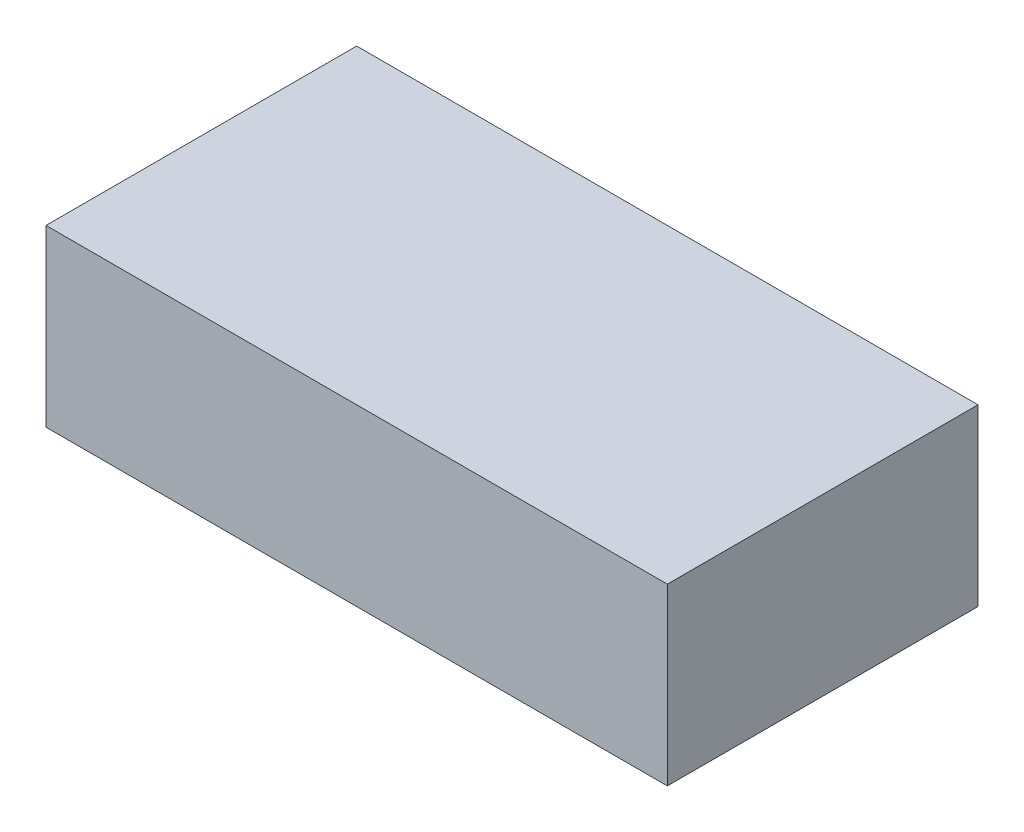
ISO-10303-21;
HEADER;
FILE_DESCRIPTION(('STEP AP214'),'2;1');
FILE_NAME('part.step','',(''),(''),'','','');
FILE_SCHEMA(('AUTOMOTIVE_DESIGN { 1 0 10303 214 1 1 1 1 }'));
ENDSEC;
DATA;
#1=APPLICATION_CONTEXT('core data for automotive mechanical design processes');
#2=APPLICATION_PROTOCOL_DEFINITION('international standard','automotive_design',2000,#1);
#3=PRODUCT_CONTEXT('',#1,'mechanical');
#4=PRODUCT('Part','Part','',(#3));
#5=PRODUCT_RELATED_PRODUCT_CATEGORY('part','',(#4));
#6=PRODUCT_DEFINITION_FORMATION('','',#4);
#7=PRODUCT_DEFINITION_CONTEXT('part definition',#1,'design');
#8=PRODUCT_DEFINITION('design','',#6,#7);
#9=PRODUCT_DEFINITION_SHAPE('','',#8);
#10=(LENGTH_UNIT() NAMED_UNIT(*) SI_UNIT(.MILLI.,.METRE.));
#11=(NAMED_UNIT(*) PLANE_ANGLE_UNIT() SI_UNIT($,.RADIAN.));
#12=(NAMED_UNIT(*) SI_UNIT($,.STERADIAN.) SOLID_ANGLE_UNIT());
#13=UNCERTAINTY_MEASURE_WITH_UNIT(LENGTH_MEASURE(1.E-05),#10,'distance_accuracy_value','');
#14=(GEOMETRIC_REPRESENTATION_CONTEXT(3) GLOBAL_UNCERTAINTY_ASSIGNED_CONTEXT((#13)) GLOBAL_UNIT_ASSIGNED_CONTEXT((#10,
#11,#12)) REPRESENTATION_CONTEXT('',''));
#15=CARTESIAN_POINT('',(0.,0.,0.));
#16=DIRECTION('',(0.,0.,1.));
#17=DIRECTION('',(1.,0.,0.));
#18=AXIS2_PLACEMENT_3D('',#15,#16,#17);
#19=CARTESIAN_POINT('',(-5.1561,3.4756,0.971599999999972));
#20=DIRECTION('',(1.,0.,0.));
#21=DIRECTION('',(0.,0.,-1.));
#22=AXIS2_PLACEMENT_3D('',#19,#20,#21);
#23=PLANE('',#22);
#24=DIRECTION('',(0.,-1.,0.));
#25=VECTOR('',#24,1.);
#26=CARTESIAN_POINT('',(-5.1561,3.4756,0.971599999999972));
#27=LINE('',#26,#25);
#28=CARTESIAN_POINT('',(-5.1561,3.4756,0.971599999999972));
#29=VERTEX_POINT('',#28);
#30=CARTESIAN_POINT('',(-5.1561,3.0256,0.971599999999972));
#31=VERTEX_POINT('',#30);
#32=EDGE_CURVE('E11',#29,#31,#27,.T.);
#33=ORIENTED_EDGE('',*,*,#32,.T.);
#34=DIRECTION('',(0.,0.,1.));
#35=VECTOR('',#34,1.);
#36=CARTESIAN_POINT('',(-5.1561,3.0256,0.971599999999972));
#37=LINE('',#36,#35);
#38=CARTESIAN_POINT('',(-5.1561,3.0256,1.7716));
#39=VERTEX_POINT('',#38);
#40=EDGE_CURVE('E24',#31,#39,#37,.T.);
#41=ORIENTED_EDGE('',*,*,#40,.T.);
#42=DIRECTION('',(0.,-1.,0.));
#43=VECTOR('',#42,1.);
#44=CARTESIAN_POINT('',(-5.1561,3.4756,1.7716));
#45=LINE('',#44,#43);
#46=CARTESIAN_POINT('',(-5.1561,3.4756,1.7716));
#47=VERTEX_POINT('',#46);
#48=EDGE_CURVE('E86',#47,#39,#45,.T.);
#49=ORIENTED_EDGE('',*,*,#48,.F.);
#50=DIRECTION('',(0.,0.,1.));
#51=VECTOR('',#50,1.);
#52=CARTESIAN_POINT('',(-5.1561,3.4756,0.971599999999972));
#53=LINE('',#52,#51);
#54=EDGE_CURVE('E84',#29,#47,#53,.T.);
#55=ORIENTED_EDGE('',*,*,#54,.F.);
#56=EDGE_LOOP('',(#33,#41,#49,#55));
#57=FACE_BOUND('',#56,.T.);
#58=ADVANCED_FACE('F17',(#57),#23,.F.);
#59=CARTESIAN_POINT('',(-3.5561,3.4756,1.7716));
#60=DIRECTION('',(0.,0.,-1.));
#61=DIRECTION('',(-1.,0.,0.));
#62=AXIS2_PLACEMENT_3D('',#59,#60,#61);
#63=PLANE('',#62);
#64=ORIENTED_EDGE('',*,*,#48,.T.);
#65=DIRECTION('',(-1.,0.,0.));
#66=VECTOR('',#65,1.);
#67=CARTESIAN_POINT('',(-5.1561,3.0256,1.7716));
#68=LINE('',#67,#66);
#69=CARTESIAN_POINT('',(-3.5561,3.0256,1.7716));
#70=VERTEX_POINT('',#69);
#71=EDGE_CURVE('E81',#70,#39,#68,.T.);
#72=ORIENTED_EDGE('',*,*,#71,.F.);
#73=DIRECTION('',(0.,-1.,0.));
#74=VECTOR('',#73,1.);
#75=CARTESIAN_POINT('',(-3.5561,3.4756,1.7716));
#76=LINE('',#75,#74);
#77=CARTESIAN_POINT('',(-3.5561,3.4756,1.7716));
#78=VERTEX_POINT('',#77);
#79=EDGE_CURVE('E79',#78,#70,#76,.T.);
#80=ORIENTED_EDGE('',*,*,#79,.F.);
#81=DIRECTION('',(1.,0.,0.));
#82=VECTOR('',#81,1.);
#83=CARTESIAN_POINT('',(-3.5561,3.4756,1.7716));
#84=LINE('',#83,#82);
#85=EDGE_CURVE('E70',#47,#78,#84,.T.);
#86=ORIENTED_EDGE('',*,*,#85,.F.);
#87=EDGE_LOOP('',(#64,#72,#80,#86));
#88=FACE_BOUND('',#87,.T.);
#89=ADVANCED_FACE('F90',(#88),#63,.F.);
#90=CARTESIAN_POINT('',(-3.5561,3.4756,0.971599999999972));
#91=DIRECTION('',(-1.,0.,0.));
#92=DIRECTION('',(0.,0.,1.));
#93=AXIS2_PLACEMENT_3D('',#90,#91,#92);
#94=PLANE('',#93);
#95=ORIENTED_EDGE('',*,*,#79,.T.);
#96=DIRECTION('',(0.,0.,1.));
#97=VECTOR('',#96,1.);
#98=CARTESIAN_POINT('',(-3.5561,3.0256,0.971599999999972));
#99=LINE('',#98,#97);
#100=CARTESIAN_POINT('',(-3.5561,3.0256,0.971599999999972));
#101=VERTEX_POINT('',#100);
#102=EDGE_CURVE('E60',#101,#70,#99,.T.);
#103=ORIENTED_EDGE('',*,*,#102,.F.);
#104=DIRECTION('',(0.,-1.,0.));
#105=VECTOR('',#104,1.);
#106=CARTESIAN_POINT('',(-3.5561,3.4756,0.971599999999972));
#107=LINE('',#106,#105);
#108=CARTESIAN_POINT('',(-3.5561,3.4756,0.971599999999972));
#109=VERTEX_POINT('',#108);
#110=EDGE_CURVE('E54',#109,#101,#107,.T.);
#111=ORIENTED_EDGE('',*,*,#110,.F.);
#112=DIRECTION('',(0.,0.,-1.));
#113=VECTOR('',#112,1.);
#114=CARTESIAN_POINT('',(-3.5561,3.4756,0.971599999999972));
#115=LINE('',#114,#113);
#116=EDGE_CURVE('E58',#78,#109,#115,.T.);
#117=ORIENTED_EDGE('',*,*,#116,.F.);
#118=EDGE_LOOP('',(#95,#103,#111,#117));
#119=FACE_BOUND('',#118,.T.);
#120=ADVANCED_FACE('F57',(#119),#94,.F.);
#121=CARTESIAN_POINT('',(-3.5561,3.4756,0.971599999999972));
#122=DIRECTION('',(0.,0.,1.));
#123=DIRECTION('',(1.,0.,0.));
#124=AXIS2_PLACEMENT_3D('',#121,#122,#123);
#125=PLANE('',#124);
#126=ORIENTED_EDGE('',*,*,#110,.T.);
#127=DIRECTION('',(-1.,0.,0.));
#128=VECTOR('',#127,1.);
#129=CARTESIAN_POINT('',(-5.1561,3.0256,0.971599999999972));
#130=LINE('',#129,#128);
#131=EDGE_CURVE('E71',#101,#31,#130,.T.);
#132=ORIENTED_EDGE('',*,*,#131,.T.);
#133=ORIENTED_EDGE('',*,*,#32,.F.);
#134=DIRECTION('',(-1.,0.,0.));
#135=VECTOR('',#134,1.);
#136=CARTESIAN_POINT('',(-3.5561,3.4756,0.971599999999972));
#137=LINE('',#136,#135);
#138=EDGE_CURVE('E68',#109,#29,#137,.T.);
#139=ORIENTED_EDGE('',*,*,#138,.F.);
#140=EDGE_LOOP('',(#126,#132,#133,#139));
#141=FACE_BOUND('',#140,.T.);
#142=ADVANCED_FACE('F73',(#141),#125,.F.);
#143=CARTESIAN_POINT('',(-5.1561,3.4756,1.7716));
#144=DIRECTION('',(0.,-1.,0.));
#145=DIRECTION('',(0.,0.,-1.));
#146=AXIS2_PLACEMENT_3D('',#143,#144,#145);
#147=PLANE('',#146);
#148=ORIENTED_EDGE('',*,*,#54,.T.);
#149=ORIENTED_EDGE('',*,*,#85,.T.);
#150=ORIENTED_EDGE('',*,*,#116,.T.);
#151=ORIENTED_EDGE('',*,*,#138,.T.);
#152=EDGE_LOOP('',(#148,#149,#150,#151));
#153=FACE_BOUND('',#152,.T.);
#154=ADVANCED_FACE('F67',(#153),#147,.F.);
#155=CARTESIAN_POINT('',(-5.1561,3.0256,0.971599999999972));
#156=DIRECTION('',(0.,1.,0.));
#157=DIRECTION('',(-1.,0.,0.));
#158=AXIS2_PLACEMENT_3D('',#155,#156,#157);
#159=PLANE('',#158);
#160=ORIENTED_EDGE('',*,*,#71,.T.);
#161=ORIENTED_EDGE('',*,*,#40,.F.);
#162=ORIENTED_EDGE('',*,*,#131,.F.);
#163=ORIENTED_EDGE('',*,*,#102,.T.);
#164=EDGE_LOOP('',(#160,#161,#162,#163));
#165=FACE_BOUND('',#164,.T.);
#166=ADVANCED_FACE('F91',(#165),#159,.F.);
#167=CLOSED_SHELL('',(#58,#89,#120,#142,#154,#166));
#168=MANIFOLD_SOLID_BREP('B1',#167);
#169=ADVANCED_BREP_SHAPE_REPRESENTATION('',(#18,#168),#14);
#170=SHAPE_DEFINITION_REPRESENTATION(#9,#169);
ENDSEC;
END-ISO-10303-21;
